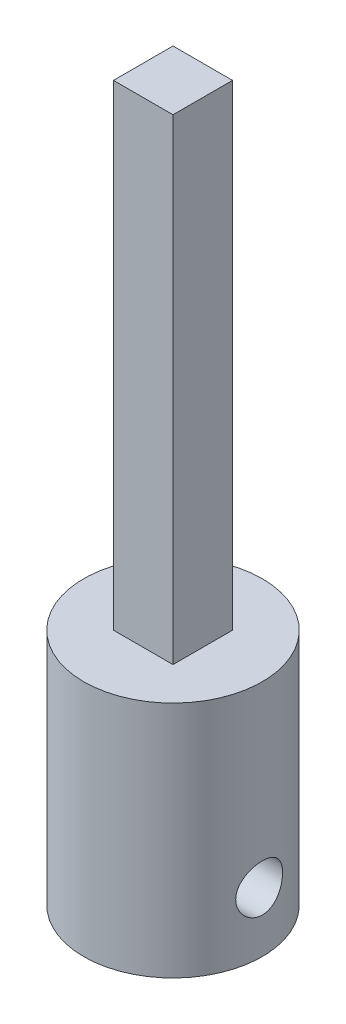
ISO-10303-21;
HEADER;
FILE_DESCRIPTION(('STEP AP214'),'2;1');
FILE_NAME('part.step','',(''),(''),'','','');
FILE_SCHEMA(('AUTOMOTIVE_DESIGN { 1 0 10303 214 1 1 1 1 }'));
ENDSEC;
DATA;
#1=APPLICATION_CONTEXT('core data for automotive mechanical design processes');
#2=APPLICATION_PROTOCOL_DEFINITION('international standard','automotive_design',2000,#1);
#3=PRODUCT_CONTEXT('',#1,'mechanical');
#4=PRODUCT('Part','Part','',(#3));
#5=PRODUCT_RELATED_PRODUCT_CATEGORY('part','',(#4));
#6=PRODUCT_DEFINITION_FORMATION('','',#4);
#7=PRODUCT_DEFINITION_CONTEXT('part definition',#1,'design');
#8=PRODUCT_DEFINITION('design','',#6,#7);
#9=PRODUCT_DEFINITION_SHAPE('','',#8);
#10=(LENGTH_UNIT() NAMED_UNIT(*) SI_UNIT(.MILLI.,.METRE.));
#11=(NAMED_UNIT(*) PLANE_ANGLE_UNIT() SI_UNIT($,.RADIAN.));
#12=(NAMED_UNIT(*) SI_UNIT($,.STERADIAN.) SOLID_ANGLE_UNIT());
#13=UNCERTAINTY_MEASURE_WITH_UNIT(LENGTH_MEASURE(1.E-05),#10,'distance_accuracy_value','');
#14=(GEOMETRIC_REPRESENTATION_CONTEXT(3) GLOBAL_UNCERTAINTY_ASSIGNED_CONTEXT((#13)) GLOBAL_UNIT_ASSIGNED_CONTEXT((#10,
#11,#12)) REPRESENTATION_CONTEXT('',''));
#15=CARTESIAN_POINT('',(0.,0.,0.));
#16=DIRECTION('',(0.,0.,1.));
#17=DIRECTION('',(1.,0.,0.));
#18=AXIS2_PLACEMENT_3D('',#15,#16,#17);
#19=CARTESIAN_POINT('',(-1.5875,38.1,1.5875));
#20=DIRECTION('',(0.,-1.,0.));
#21=DIRECTION('',(0.,0.,-1.));
#22=AXIS2_PLACEMENT_3D('',#19,#20,#21);
#23=PLANE('',#22);
#24=DIRECTION('',(-1.,0.,0.));
#25=VECTOR('',#24,1.);
#26=CARTESIAN_POINT('',(0.,38.1,-1.5875));
#27=LINE('',#26,#25);
#28=CARTESIAN_POINT('',(1.5875,38.1,-1.5875));
#29=VERTEX_POINT('',#28);
#30=CARTESIAN_POINT('',(-1.5875,38.1,-1.5875));
#31=VERTEX_POINT('',#30);
#32=EDGE_CURVE('E58',#29,#31,#27,.T.);
#33=ORIENTED_EDGE('',*,*,#32,.T.);
#34=DIRECTION('',(0.,0.,1.));
#35=VECTOR('',#34,1.);
#36=CARTESIAN_POINT('',(-1.5875,38.1,0.));
#37=LINE('',#36,#35);
#38=CARTESIAN_POINT('',(-1.5875,38.1,1.5875));
#39=VERTEX_POINT('',#38);
#40=EDGE_CURVE('E132',#31,#39,#37,.T.);
#41=ORIENTED_EDGE('',*,*,#40,.T.);
#42=DIRECTION('',(1.,0.,0.));
#43=VECTOR('',#42,1.);
#44=CARTESIAN_POINT('',(0.,38.1,1.5875));
#45=LINE('',#44,#43);
#46=CARTESIAN_POINT('',(1.5875,38.1,1.5875));
#47=VERTEX_POINT('',#46);
#48=EDGE_CURVE('E76',#39,#47,#45,.T.);
#49=ORIENTED_EDGE('',*,*,#48,.T.);
#50=DIRECTION('',(0.,0.,-1.));
#51=VECTOR('',#50,1.);
#52=CARTESIAN_POINT('',(1.5875,38.1,0.));
#53=LINE('',#52,#51);
#54=EDGE_CURVE('E69',#47,#29,#53,.T.);
#55=ORIENTED_EDGE('',*,*,#54,.T.);
#56=EDGE_LOOP('',(#33,#41,#49,#55));
#57=FACE_BOUND('',#56,.T.);
#58=ADVANCED_FACE('F16',(#57),#23,.F.);
#59=CARTESIAN_POINT('',(-1.5875,12.7,-1.5875));
#60=DIRECTION('',(0.,0.,1.));
#61=DIRECTION('',(1.,0.,0.));
#62=AXIS2_PLACEMENT_3D('',#59,#60,#61);
#63=PLANE('',#62);
#64=DIRECTION('',(0.,1.,0.));
#65=VECTOR('',#64,1.);
#66=CARTESIAN_POINT('',(-1.5875,25.4,-1.5875));
#67=LINE('',#66,#65);
#68=CARTESIAN_POINT('',(-1.58749999980315,12.7,-1.58749999980315));
#69=VERTEX_POINT('',#68);
#70=EDGE_CURVE('E64',#69,#31,#67,.T.);
#71=ORIENTED_EDGE('',*,*,#70,.T.);
#72=ORIENTED_EDGE('',*,*,#32,.F.);
#73=DIRECTION('',(0.,-1.,0.));
#74=VECTOR('',#73,1.);
#75=CARTESIAN_POINT('',(1.5875,25.4,-1.5875));
#76=LINE('',#75,#74);
#77=CARTESIAN_POINT('',(1.58749999980315,12.7,-1.58749999980315));
#78=VERTEX_POINT('',#77);
#79=EDGE_CURVE('E62',#29,#78,#76,.T.);
#80=ORIENTED_EDGE('',*,*,#79,.T.);
#81=DIRECTION('',(1.,0.,0.));
#82=VECTOR('',#81,1.);
#83=CARTESIAN_POINT('',(0.,12.7,-1.5874999992126));
#84=LINE('',#83,#82);
#85=EDGE_CURVE('E128',#69,#78,#84,.T.);
#86=ORIENTED_EDGE('',*,*,#85,.F.);
#87=EDGE_LOOP('',(#71,#72,#80,#86));
#88=FACE_BOUND('',#87,.T.);
#89=ADVANCED_FACE('F60',(#88),#63,.F.);
#90=CARTESIAN_POINT('',(1.5875,12.7,-1.5875));
#91=DIRECTION('',(-1.,0.,0.));
#92=DIRECTION('',(0.,0.,1.));
#93=AXIS2_PLACEMENT_3D('',#90,#91,#92);
#94=PLANE('',#93);
#95=ORIENTED_EDGE('',*,*,#79,.F.);
#96=ORIENTED_EDGE('',*,*,#54,.F.);
#97=DIRECTION('',(0.,-1.,0.));
#98=VECTOR('',#97,1.);
#99=CARTESIAN_POINT('',(1.5875,25.4,1.5875));
#100=LINE('',#99,#98);
#101=CARTESIAN_POINT('',(1.58749999980315,12.7,1.58749999980315));
#102=VERTEX_POINT('',#101);
#103=EDGE_CURVE('E135',#47,#102,#100,.T.);
#104=ORIENTED_EDGE('',*,*,#103,.T.);
#105=DIRECTION('',(0.,0.,1.));
#106=VECTOR('',#105,1.);
#107=CARTESIAN_POINT('',(1.5874999992126,12.7,0.));
#108=LINE('',#107,#106);
#109=EDGE_CURVE('E75',#78,#102,#108,.T.);
#110=ORIENTED_EDGE('',*,*,#109,.F.);
#111=EDGE_LOOP('',(#95,#96,#104,#110));
#112=FACE_BOUND('',#111,.T.);
#113=ADVANCED_FACE('F72',(#112),#94,.F.);
#114=CARTESIAN_POINT('',(1.5875,12.7,1.5875));
#115=DIRECTION('',(0.,0.,-1.));
#116=DIRECTION('',(-1.,0.,0.));
#117=AXIS2_PLACEMENT_3D('',#114,#115,#116);
#118=PLANE('',#117);
#119=ORIENTED_EDGE('',*,*,#103,.F.);
#120=ORIENTED_EDGE('',*,*,#48,.F.);
#121=DIRECTION('',(0.,-1.,0.));
#122=VECTOR('',#121,1.);
#123=CARTESIAN_POINT('',(-1.5875,25.4,1.5875));
#124=LINE('',#123,#122);
#125=CARTESIAN_POINT('',(-1.58749999980315,12.7,1.58749999980315));
#126=VERTEX_POINT('',#125);
#127=EDGE_CURVE('E130',#39,#126,#124,.T.);
#128=ORIENTED_EDGE('',*,*,#127,.T.);
#129=DIRECTION('',(-1.,0.,0.));
#130=VECTOR('',#129,1.);
#131=CARTESIAN_POINT('',(0.,12.7,1.5874999992126));
#132=LINE('',#131,#130);
#133=EDGE_CURVE('E35',#102,#126,#132,.T.);
#134=ORIENTED_EDGE('',*,*,#133,.F.);
#135=EDGE_LOOP('',(#119,#120,#128,#134));
#136=FACE_BOUND('',#135,.T.);
#137=ADVANCED_FACE('F137',(#136),#118,.F.);
#138=CARTESIAN_POINT('',(-1.5875,12.7,1.5875));
#139=DIRECTION('',(1.,0.,0.));
#140=DIRECTION('',(0.,0.,-1.));
#141=AXIS2_PLACEMENT_3D('',#138,#139,#140);
#142=PLANE('',#141);
#143=ORIENTED_EDGE('',*,*,#127,.F.);
#144=ORIENTED_EDGE('',*,*,#40,.F.);
#145=ORIENTED_EDGE('',*,*,#70,.F.);
#146=DIRECTION('',(0.,0.,-1.));
#147=VECTOR('',#146,1.);
#148=CARTESIAN_POINT('',(-1.5874999992126,12.7,0.));
#149=LINE('',#148,#147);
#150=EDGE_CURVE('E121',#126,#69,#149,.T.);
#151=ORIENTED_EDGE('',*,*,#150,.F.);
#152=EDGE_LOOP('',(#143,#144,#145,#151));
#153=FACE_BOUND('',#152,.T.);
#154=ADVANCED_FACE('F142',(#153),#142,.F.);
#155=CARTESIAN_POINT('',(0.,7.551721238,0.));
#156=DIRECTION('',(0.,-1.,0.));
#157=DIRECTION('',(0.,0.,-1.));
#158=AXIS2_PLACEMENT_3D('',#155,#156,#157);
#159=CONICAL_SURFACE('',#158,0.,1.0297442586969);
#160=CARTESIAN_POINT('',(0.,7.551721238,0.));
#161=VERTEX_POINT('',#160);
#162=VERTEX_LOOP('',#161);
#163=FACE_BOUND('',#162,.T.);
#164=CARTESIAN_POINT('',(0.,6.35,0.));
#165=DIRECTION('',(0.,-1.,0.));
#166=DIRECTION('',(0.,0.,-1.));
#167=AXIS2_PLACEMENT_3D('',#164,#165,#166);
#168=CIRCLE('',#167,2.);
#169=CARTESIAN_POINT('',(0.,6.35,-2.));
#170=VERTEX_POINT('',#169);
#171=EDGE_CURVE('E117',#170,#170,#168,.F.);
#172=ORIENTED_EDGE('',*,*,#171,.F.);
#173=EDGE_LOOP('',(#172));
#174=FACE_BOUND('',#173,.T.);
#175=ADVANCED_FACE('F144',(#163,#174),#159,.F.);
#176=CARTESIAN_POINT('',(-4.81965,0.,-4.81965));
#177=DIRECTION('',(0.,1.,0.));
#178=DIRECTION('',(0.,0.,1.));
#179=AXIS2_PLACEMENT_3D('',#176,#177,#178);
#180=PLANE('',#179);
#181=CARTESIAN_POINT('',(0.,0.,0.));
#182=DIRECTION('',(0.,-1.,0.));
#183=DIRECTION('',(0.,0.,-1.));
#184=AXIS2_PLACEMENT_3D('',#181,#182,#183);
#185=CIRCLE('',#184,2.);
#186=CARTESIAN_POINT('',(0.,0.,-2.));
#187=VERTEX_POINT('',#186);
#188=EDGE_CURVE('E20',#187,#187,#185,.T.);
#189=ORIENTED_EDGE('',*,*,#188,.F.);
#190=EDGE_LOOP('',(#189));
#191=FACE_BOUND('',#190,.T.);
#192=CARTESIAN_POINT('',(0.,0.,0.));
#193=DIRECTION('',(0.,-1.,0.));
#194=DIRECTION('',(0.,0.,-1.));
#195=AXIS2_PLACEMENT_3D('',#192,#193,#194);
#196=CIRCLE('',#195,4.7625);
#197=CARTESIAN_POINT('',(0.,0.,-4.7625));
#198=VERTEX_POINT('',#197);
#199=EDGE_CURVE('E110',#198,#198,#196,.T.);
#200=ORIENTED_EDGE('',*,*,#199,.T.);
#201=EDGE_LOOP('',(#200));
#202=FACE_BOUND('',#201,.T.);
#203=ADVANCED_FACE('F150',(#191,#202),#180,.F.);
#204=CARTESIAN_POINT('',(-4.81965,12.7,-4.81965));
#205=DIRECTION('',(0.,1.,0.));
#206=DIRECTION('',(0.,0.,1.));
#207=AXIS2_PLACEMENT_3D('',#204,#205,#206);
#208=PLANE('',#207);
#209=ORIENTED_EDGE('',*,*,#133,.T.);
#210=ORIENTED_EDGE('',*,*,#150,.T.);
#211=ORIENTED_EDGE('',*,*,#85,.T.);
#212=ORIENTED_EDGE('',*,*,#109,.T.);
#213=EDGE_LOOP('',(#209,#210,#211,#212));
#214=FACE_BOUND('',#213,.T.);
#215=CARTESIAN_POINT('',(0.,12.7,0.));
#216=DIRECTION('',(0.,-1.,0.));
#217=DIRECTION('',(0.,0.,-1.));
#218=AXIS2_PLACEMENT_3D('',#215,#216,#217);
#219=CIRCLE('',#218,4.7625);
#220=CARTESIAN_POINT('',(0.,12.7,-4.7625));
#221=VERTEX_POINT('',#220);
#222=EDGE_CURVE('E108',#221,#221,#219,.F.);
#223=ORIENTED_EDGE('',*,*,#222,.T.);
#224=EDGE_LOOP('',(#223));
#225=FACE_BOUND('',#224,.T.);
#226=ADVANCED_FACE('F18',(#214,#225),#208,.T.);
#227=CARTESIAN_POINT('',(0.,6.35,0.));
#228=DIRECTION('',(0.,-1.,0.));
#229=DIRECTION('',(0.,0.,-1.));
#230=AXIS2_PLACEMENT_3D('',#227,#228,#229);
#231=CYLINDRICAL_SURFACE('',#230,2.);
#232=ORIENTED_EDGE('',*,*,#171,.T.);
#233=EDGE_LOOP('',(#232));
#234=FACE_BOUND('',#233,.T.);
#235=ORIENTED_EDGE('',*,*,#188,.T.);
#236=EDGE_LOOP('',(#235));
#237=FACE_BOUND('',#236,.T.);
#238=CARTESIAN_POINT('',(1.56124949965453,3.17499999986531,-1.25000000011434));
#239=CARTESIAN_POINT('',(1.56124938827542,3.11278040320583,-1.25000022159129));
#240=CARTESIAN_POINT('',(1.56502942539308,3.05056151910375,-1.24532194300287));
#241=CARTESIAN_POINT('',(1.57945401750056,2.92825635667223,-1.22696927296276));
#242=CARTESIAN_POINT('',(1.59010783277162,2.86817307077839,-1.21328274519149));
#243=CARTESIAN_POINT('',(1.61649865831677,2.75222074232233,-1.17788327757186));
#244=CARTESIAN_POINT('',(1.63219440651097,2.69632188399165,-1.15623529104412));
#245=CARTESIAN_POINT('',(1.66682507559097,2.58900467032804,-1.10572634790888));
#246=CARTESIAN_POINT('',(1.68576086719825,2.53758752502101,-1.07686345142029));
#247=CARTESIAN_POINT('',(1.72779644664076,2.43313354706731,-1.00823878620259));
#248=CARTESIAN_POINT('',(1.75111416473277,2.38080337841734,-0.967534712229244));
#249=CARTESIAN_POINT('',(1.79752900985797,2.28311584934567,-0.878307001975436));
#250=CARTESIAN_POINT('',(1.82062593732158,2.23776432371404,-0.829776891081533));
#251=CARTESIAN_POINT('',(1.86729453098001,2.1498963916868,-0.719186676027812));
#252=CARTESIAN_POINT('',(1.89058721552083,2.10838233418294,-0.656200585050809));
#253=CARTESIAN_POINT('',(1.93183231403426,2.03687481004302,-0.522404086655155));
#254=CARTESIAN_POINT('',(1.94979001046533,2.00686993891259,-0.451601514700437));
#255=CARTESIAN_POINT('',(1.9766984026714,1.96251770450137,-0.311776931814877));
#256=CARTESIAN_POINT('',(1.98637920860932,1.94688860833016,-0.243305746755942));
#257=CARTESIAN_POINT('',(1.99850543978007,1.9273679372035,-0.104105214897239));
#258=CARTESIAN_POINT('',(2.00095845948749,1.92346404210714,-0.0333783173194434));
#259=CARTESIAN_POINT('',(1.99852909059264,1.92735569012764,0.0980658544418839));
#260=CARTESIAN_POINT('',(1.99458699474023,1.93365138233011,0.158852574881734));
#261=CARTESIAN_POINT('',(1.98145271485694,1.95486699632152,0.278306695575517));
#262=CARTESIAN_POINT('',(1.97226013843398,1.96978756268718,0.336973937082778));
#263=CARTESIAN_POINT('',(1.94938137556598,2.00760371246045,0.450888920855377));
#264=CARTESIAN_POINT('',(1.93568371104434,2.03051967573114,0.506127495705006));
#265=CARTESIAN_POINT('',(1.9048564476165,2.08346853765739,0.612018868544289));
#266=CARTESIAN_POINT('',(1.88772604335696,2.11350310670825,0.662670586357329));
#267=CARTESIAN_POINT('',(1.84893170021082,2.1840291993235,0.764714957693036));
#268=CARTESIAN_POINT('',(1.8269688691242,2.22535698926945,0.815415066656694));
#269=CARTESIAN_POINT('',(1.78195340501495,2.31513479637323,0.909600886819619));
#270=CARTESIAN_POINT('',(1.75889927640831,2.36359479161726,0.953076306111875));
#271=CARTESIAN_POINT('',(1.71071866721843,2.473696574059,1.03734710152266));
#272=CARTESIAN_POINT('',(1.68571409118972,2.53623326235058,1.07705329887823));
#273=CARTESIAN_POINT('',(1.64014836847067,2.6686199443545,1.14525155807959));
#274=CARTESIAN_POINT('',(1.61958051940919,2.73845866682749,1.17376058924248));
#275=CARTESIAN_POINT('',(1.58990661095037,2.86923673140491,1.21354346324764));
#276=CARTESIAN_POINT('',(1.5793250812737,2.92912747860853,1.22713451491084));
#277=CARTESIAN_POINT('',(1.56500229231613,3.0510148485429,1.24535519029694));
#278=CARTESIAN_POINT('',(1.56124961059614,3.11300777770638,1.24999977930193));
#279=CARTESIAN_POINT('',(1.56124938819595,3.23721959615457,1.25000022150755));
#280=CARTESIAN_POINT('',(1.5650294253267,3.2994384802409,1.24532194303669));
#281=CARTESIAN_POINT('',(1.57945401740882,3.42174364264341,1.22696927313012));
#282=CARTESIAN_POINT('',(1.59010783264102,3.48182692852409,1.21328274537513));
#283=CARTESIAN_POINT('',(1.61649865812732,3.59777925696843,1.17788327781752));
#284=CARTESIAN_POINT('',(1.63219440630191,3.65367811530008,1.15623529133443));
#285=CARTESIAN_POINT('',(1.66682507534577,3.76099532897265,1.1057263482811));
#286=CARTESIAN_POINT('',(1.68576086693664,3.8124124742875,1.07686345182952));
#287=CARTESIAN_POINT('',(1.7277964463485,3.91686645225347,1.00823878669994));
#288=CARTESIAN_POINT('',(1.75111416442701,3.9691966209096,0.967534712779549));
#289=CARTESIAN_POINT('',(1.7975290095339,4.06688415000181,0.878307002635976));
#290=CARTESIAN_POINT('',(1.82062593699272,4.11223567564796,0.829776891799511));
#291=CARTESIAN_POINT('',(1.86729453066421,4.20010360773971,0.719186676844787));
#292=CARTESIAN_POINT('',(1.89058721522313,4.24161766529066,0.656200585905674));
#293=CARTESIAN_POINT('',(1.93183231378385,4.3131251895331,0.522404087577916));
#294=CARTESIAN_POINT('',(1.94979001024404,4.3431300607188,0.451601515653104));
#295=CARTESIAN_POINT('',(1.97669840251833,4.38748229524978,0.311776932787493));
#296=CARTESIAN_POINT('',(1.9863792084922,4.40311139148069,0.243305747718032));
#297=CARTESIAN_POINT('',(1.99850543973245,4.42263206272048,0.104105215824801));
#298=CARTESIAN_POINT('',(2.00095845947343,4.42653595787035,0.0333783182230314));
#299=CARTESIAN_POINT('',(1.99852909063528,4.42264430994061,-0.0980658535808882));
#300=CARTESIAN_POINT('',(1.99458699480797,4.41634861777853,-0.158852574038031));
#301=CARTESIAN_POINT('',(1.9814527149702,4.39513300386221,-0.278306694772943));
#302=CARTESIAN_POINT('',(1.97226013856767,4.38021243753127,-0.336973936304045));
#303=CARTESIAN_POINT('',(1.94938137573886,4.34239628782783,-0.450888920108097));
#304=CARTESIAN_POINT('',(1.93568371123757,4.31948032459507,-0.50612749496662));
#305=CARTESIAN_POINT('',(1.90485644784636,4.26653146274309,-0.612018867829485));
#306=CARTESIAN_POINT('',(1.88772604360307,4.23649689372851,-0.66267058565718));
#307=CARTESIAN_POINT('',(1.848931700489,4.16597080119423,-0.764714957020644));
#308=CARTESIAN_POINT('',(1.82696886941795,4.12464301129393,-0.815415065998891));
#309=CARTESIAN_POINT('',(1.78195340533301,4.03486520428359,-0.909600886197447));
#310=CARTESIAN_POINT('',(1.75889927673515,3.98640520908756,-0.953076305510943));
#311=CARTESIAN_POINT('',(1.71071866754758,3.87630342674088,-1.03734710097998));
#312=CARTESIAN_POINT('',(1.68571409151093,3.81376673849535,-1.07705329837191));
#313=CARTESIAN_POINT('',(1.64014836876188,3.68138005657822,-1.14525155766937));
#314=CARTESIAN_POINT('',(1.61958051967866,3.61154133414543,-1.17376058889118));
#315=CARTESIAN_POINT('',(1.58990661108416,3.48076326935573,-1.21354346306038));
#316=CARTESIAN_POINT('',(1.57932508132493,3.42087252188445,-1.2271345147954));
#317=CARTESIAN_POINT('',(1.56500229231605,3.29898515139924,-1.24535519034723));
#318=CARTESIAN_POINT('',(1.56124961062661,3.23699222195278,-1.24999977944676));
#319=CARTESIAN_POINT('',(1.56124949965453,3.17499999986531,-1.25000000011434));
#320=B_SPLINE_CURVE_WITH_KNOTS('',3,(#238,#239,#240,#241,#242,#243,#244,#245,#246,#247,#248,
#249,#250,#251,#252,#253,#254,#255,#256,#257,#258,#259,#260,#261,#262,#263,#264,#265,#266,#267,
#268,#269,#270,#271,#272,#273,#274,#275,#276,#277,#278,#279,#280,#281,#282,#283,#284,#285,#286,
#287,#288,#289,#290,#291,#292,#293,#294,#295,#296,#297,#298,#299,#300,#301,#302,#303,#304,#305,
#306,#307,#308,#309,#310,#311,#312,#313,#314,#315,#316,#317,#318,#319),.UNSPECIFIED.,.T.,.F.,(4,
2,2,2,2,2,2,2,2,2,2,2,2,2,2,2,2,2,2,2,2,2,2,2,2,2,2,2,2,2,2,2,2,2,2,2,2,2,2,2,4),(0.,
0.186389987030503,0.373031602480598,0.558183116341958,0.743384465749119,0.953409737414884,
1.16360966649413,1.39917228848917,1.63450088389039,1.8459039143789,2.05708473734372,
2.23992322918253,2.42277538715406,2.60609707277001,2.7894618178545,2.99565048044693,
3.20213039617,3.43554174582671,3.66859798266507,3.85461826582984,4.04032711061492,
4.22671709757929,4.41335871295399,4.59851022675978,4.78371157611824,4.99373684769377,
5.20393677667866,5.43949939867429,5.6748279940793,5.88623102465166,6.09741184769902,
6.28025033957134,6.46310249757589,6.64642418315973,6.8297889282134,7.03597759074169,
7.24245750639516,7.47586885600769,7.70892509281849,7.89494537683846,8.08065422246329),.UNSPECIFIED.);
#321=CARTESIAN_POINT('',(1.56124949965453,3.17499999986531,-1.25000000011434));
#322=VERTEX_POINT('',#321);
#323=EDGE_CURVE('E26',#322,#322,#320,.T.);
#324=ORIENTED_EDGE('',*,*,#323,.F.);
#325=EDGE_LOOP('',(#324));
#326=FACE_BOUND('',#325,.T.);
#327=ADVANCED_FACE('F101',(#234,#237,#326),#231,.F.);
#328=CARTESIAN_POINT('',(0.,12.7,0.));
#329=DIRECTION('',(0.,-1.,0.));
#330=DIRECTION('',(0.,0.,-1.));
#331=AXIS2_PLACEMENT_3D('',#328,#329,#330);
#332=CYLINDRICAL_SURFACE('',#331,4.7625);
#333=ORIENTED_EDGE('',*,*,#199,.F.);
#334=EDGE_LOOP('',(#333));
#335=FACE_BOUND('',#334,.T.);
#336=ORIENTED_EDGE('',*,*,#222,.F.);
#337=EDGE_LOOP('',(#336));
#338=FACE_BOUND('',#337,.T.);
#339=CARTESIAN_POINT('',(4.59553111738906,3.17499999948724,1.25000000012686));
#340=CARTESIAN_POINT('',(4.5955335577232,3.10617932289054,1.24999638749731));
#341=CARTESIAN_POINT('',(4.59709585238585,3.03727867323844,1.2442907750176));
#342=CARTESIAN_POINT('',(4.60316548451005,2.90140181811141,1.22164034923421));
#343=CARTESIAN_POINT('',(4.60767832705347,2.83442945474703,1.20467452592462));
#344=CARTESIAN_POINT('',(4.61910225696683,2.70448796321729,1.1600971480348));
#345=CARTESIAN_POINT('',(4.62600877672366,2.64151147896875,1.13250585789708));
#346=CARTESIAN_POINT('',(4.64143599270005,2.52109324109774,1.06751515296638));
#347=CARTESIAN_POINT('',(4.64995632233713,2.4636502349884,1.03011796487684));
#348=CARTESIAN_POINT('',(4.66788507291328,2.35450616351819,0.945598970371005));
#349=CARTESIAN_POINT('',(4.67730891235634,2.30295929313319,0.898281254340476));
#350=CARTESIAN_POINT('',(4.69584999716229,2.2084317373202,0.79568363826105));
#351=CARTESIAN_POINT('',(4.70496719462585,2.1654523850718,0.740402501337246));
#352=CARTESIAN_POINT('',(4.72203769427046,2.08864765715547,0.622390397771418));
#353=CARTESIAN_POINT('',(4.72997082360176,2.05497407389647,0.559557469941441));
#354=CARTESIAN_POINT('',(4.74360383601301,1.9987263313629,0.428879767292523));
#355=CARTESIAN_POINT('',(4.74930409996096,1.97615027897438,0.36103584956501));
#356=CARTESIAN_POINT('',(4.75772078250739,1.94323309549472,0.22386186308498));
#357=CARTESIAN_POINT('',(4.76050069990133,1.93263120097903,0.154598333081005));
#358=CARTESIAN_POINT('',(4.76298529509464,1.92314336888178,0.0152236448354775));
#359=CARTESIAN_POINT('',(4.76269046859438,1.92425554279589,-0.0548873749561144));
#360=CARTESIAN_POINT('',(4.75910551645042,1.93797961121356,-0.192152909610125));
#361=CARTESIAN_POINT('',(4.75588877914174,1.95030976089578,-0.259337802073874));
#362=CARTESIAN_POINT('',(4.74690771632195,1.98566533584905,-0.390649710563015));
#363=CARTESIAN_POINT('',(4.74114323231392,2.00869142652575,-0.454776536069149));
#364=CARTESIAN_POINT('',(4.72760446024583,2.06500501804198,-0.578878423850538));
#365=CARTESIAN_POINT('',(4.71981114103639,2.09839029362198,-0.638806957219107));
#366=CARTESIAN_POINT('',(4.70305654770007,2.17439751767011,-0.752303938248762));
#367=CARTESIAN_POINT('',(4.69409512752462,2.21702062159347,-0.8058715890006));
#368=CARTESIAN_POINT('',(4.67566322878175,2.31178519539602,-0.906803453987166));
#369=CARTESIAN_POINT('',(4.66618553367472,2.36417104821844,-0.953937134150997));
#370=CARTESIAN_POINT('',(4.64802548096041,2.47622575286907,-1.03882431209339));
#371=CARTESIAN_POINT('',(4.63934348051382,2.53589784748995,-1.07657361043034));
#372=CARTESIAN_POINT('',(4.62372801342147,2.66133650602185,-1.14178875960598));
#373=CARTESIAN_POINT('',(4.61680639291811,2.72714048785777,-1.16918551413883));
#374=CARTESIAN_POINT('',(4.60564813559056,2.86256836194075,-1.21240165252686));
#375=CARTESIAN_POINT('',(4.60140584541694,2.93218387212397,-1.22824542401205));
#376=CARTESIAN_POINT('',(4.59769232019913,3.03115528176798,-1.24203189411947));
#377=CARTESIAN_POINT('',(4.59688410259995,3.05983259093539,-1.24501692002042));
#378=CARTESIAN_POINT('',(4.5958029888085,3.11733525178169,-1.24900173376087));
#379=CARTESIAN_POINT('',(4.59553009469441,3.14616060403487,-1.25000151389342));
#380=CARTESIAN_POINT('',(4.59553355756045,3.24382067647516,-1.24999638733176));
#381=CARTESIAN_POINT('',(4.59709585232582,3.31272132613105,-1.24429077503345));
#382=CARTESIAN_POINT('',(4.60316548451388,3.44859818126039,-1.22164034942841));
#383=CARTESIAN_POINT('',(4.60767832701789,3.5155705446235,-1.20467452611655));
#384=CARTESIAN_POINT('',(4.61910225689261,3.64551203616289,-1.16009714827139));
#385=CARTESIAN_POINT('',(4.62600877665029,3.70848852042209,-1.13250585817984));
#386=CARTESIAN_POINT('',(4.64143599262137,3.82890675832461,-1.06751515332416));
#387=CARTESIAN_POINT('',(4.64995632225242,3.88634976445439,-1.03011796526269));
#388=CARTESIAN_POINT('',(4.66788507282203,3.99549383596879,-0.945598970814924));
#389=CARTESIAN_POINT('',(4.6773089122647,4.04704070637786,-0.89828125481466));
#390=CARTESIAN_POINT('',(4.69584999707213,4.14156826224189,-0.795683638792872));
#391=CARTESIAN_POINT('',(4.70496719453757,4.18454761451757,-0.740402501896729));
#392=CARTESIAN_POINT('',(4.72203769419011,4.26135234249666,-0.622390398378479));
#393=CARTESIAN_POINT('',(4.72997082352742,4.29502592579052,-0.559557470567878));
#394=CARTESIAN_POINT('',(4.74360383595333,4.35127366839718,-0.428879767950647));
#395=CARTESIAN_POINT('',(4.74930409990989,4.37384972082378,-0.361035850235377));
#396=CARTESIAN_POINT('',(4.75772078247507,4.40676690438097,-0.223861863769995));
#397=CARTESIAN_POINT('',(4.76050069987902,4.41736879893563,-0.154598333768464));
#398=CARTESIAN_POINT('',(4.76298529509247,4.42685663111008,-0.0152236455210064));
#399=CARTESIAN_POINT('',(4.76269046860234,4.42574445723422,0.0548873742749556));
#400=CARTESIAN_POINT('',(4.75910551647747,4.41202038889033,0.192152908941834));
#401=CARTESIAN_POINT('',(4.75588877917788,4.39969023924406,0.259337801413963));
#402=CARTESIAN_POINT('',(4.74690771637457,4.36433466436051,0.390649709925271));
#403=CARTESIAN_POINT('',(4.74114323237398,4.34130857371764,0.45477653544521));
#404=CARTESIAN_POINT('',(4.72760446031886,4.28499498226827,0.578878423255284));
#405=CARTESIAN_POINT('',(4.71981114111507,4.25160970672194,0.638806956639102));
#406=CARTESIAN_POINT('',(4.70305654778717,4.17560248273799,0.752303937705844));
#407=CARTESIAN_POINT('',(4.69409512761446,4.13297937884493,0.805871588479393));
#408=CARTESIAN_POINT('',(4.67566322887344,4.03821480509954,0.906803453515237));
#409=CARTESIAN_POINT('',(4.6661855337654,3.98582895230371,0.953937133706606));
#410=CARTESIAN_POINT('',(4.64802548104735,3.87377424770472,1.03882431170756));
#411=CARTESIAN_POINT('',(4.63934348059799,3.81410215310925,1.07657361007603));
#412=CARTESIAN_POINT('',(4.62372801349178,3.68866349462038,1.14178875931518));
#413=CARTESIAN_POINT('',(4.61680639297736,3.62285951280177,1.16918551387952));
#414=CARTESIAN_POINT('',(4.60564813564191,3.48743163874148,1.21240165235782));
#415=CARTESIAN_POINT('',(4.60140584547166,3.41781612856329,1.22824542390069));
#416=CARTESIAN_POINT('',(4.59769232020496,3.31884471870077,1.24203189406056));
#417=CARTESIAN_POINT('',(4.59688410258456,3.29016740931199,1.24501691997622));
#418=CARTESIAN_POINT('',(4.5958029888249,3.232664748024,1.24900173380139));
#419=CARTESIAN_POINT('',(4.5955300947638,3.20383939555052,1.25000151400407));
#420=CARTESIAN_POINT('',(4.59553111738906,3.17499999948724,1.25000000012686));
#421=B_SPLINE_CURVE_WITH_KNOTS('',3,(#339,#340,#341,#342,#343,#344,#345,#346,#347,#348,#349,
#350,#351,#352,#353,#354,#355,#356,#357,#358,#359,#360,#361,#362,#363,#364,#365,#366,#367,#368,
#369,#370,#371,#372,#373,#374,#375,#376,#377,#378,#379,#380,#381,#382,#383,#384,#385,#386,#387,
#388,#389,#390,#391,#392,#393,#394,#395,#396,#397,#398,#399,#400,#401,#402,#403,#404,#405,#406,
#407,#408,#409,#410,#411,#412,#413,#414,#415,#416,#417,#418,#419,#420),.UNSPECIFIED.,.T.,.F.,(4,
2,2,2,2,2,2,2,2,2,2,2,2,2,2,2,2,2,2,2,2,2,2,2,2,2,2,2,2,2,2,2,2,2,2,2,2,2,2,2,4),(0.,
0.206351060983952,0.413088231189803,0.619433058125896,0.825731069214613,1.03656937935705,
1.24744047218913,1.46157161938806,1.67566622553408,1.885002698122,2.09430542267569,
2.29849229349346,2.50269186869123,2.70888061901185,2.91509517404506,3.1274132073406,
3.33982608105196,3.55363262761712,3.76698652482964,3.85345787503962,3.9399295609403,
4.14628062191517,4.35301779209154,4.55936261901126,4.76566063009944,4.97649894023496,
5.18737003305247,5.4015011802518,5.61559578640113,5.82493225900058,6.03423498356524,
6.23842185438687,6.44262142958726,6.64881017989694,6.85502473492336,7.06734276821589,
7.27975564191324,7.49356218847419,7.70691608570197,7.79338743658008,7.87985912314411),.UNSPECIFIED.);
#422=CARTESIAN_POINT('',(4.59553111738906,3.17499999948724,1.25000000012686));
#423=VERTEX_POINT('',#422);
#424=EDGE_CURVE('E11',#423,#423,#421,.T.);
#425=ORIENTED_EDGE('',*,*,#424,.F.);
#426=EDGE_LOOP('',(#425));
#427=FACE_BOUND('',#426,.T.);
#428=ADVANCED_FACE('F90',(#335,#338,#427),#332,.T.);
#429=CARTESIAN_POINT('',(1.54204192175377,3.175,0.));
#430=DIRECTION('',(1.,0.,0.));
#431=DIRECTION('',(0.,1.,0.));
#432=AXIS2_PLACEMENT_3D('',#429,#430,#431);
#433=CYLINDRICAL_SURFACE('',#432,1.25);
#434=ORIENTED_EDGE('',*,*,#424,.T.);
#435=EDGE_LOOP('',(#434));
#436=FACE_BOUND('',#435,.T.);
#437=ORIENTED_EDGE('',*,*,#323,.T.);
#438=EDGE_LOOP('',(#437));
#439=FACE_BOUND('',#438,.T.);
#440=ADVANCED_FACE('F92',(#436,#439),#433,.F.);
#441=CLOSED_SHELL('',(#58,#89,#113,#137,#154,#175,#203,#226,#327,#428,#440));
#442=MANIFOLD_SOLID_BREP('B1',#441);
#443=ADVANCED_BREP_SHAPE_REPRESENTATION('',(#18,#442),#14);
#444=SHAPE_DEFINITION_REPRESENTATION(#9,#443);
ENDSEC;
END-ISO-10303-21;
